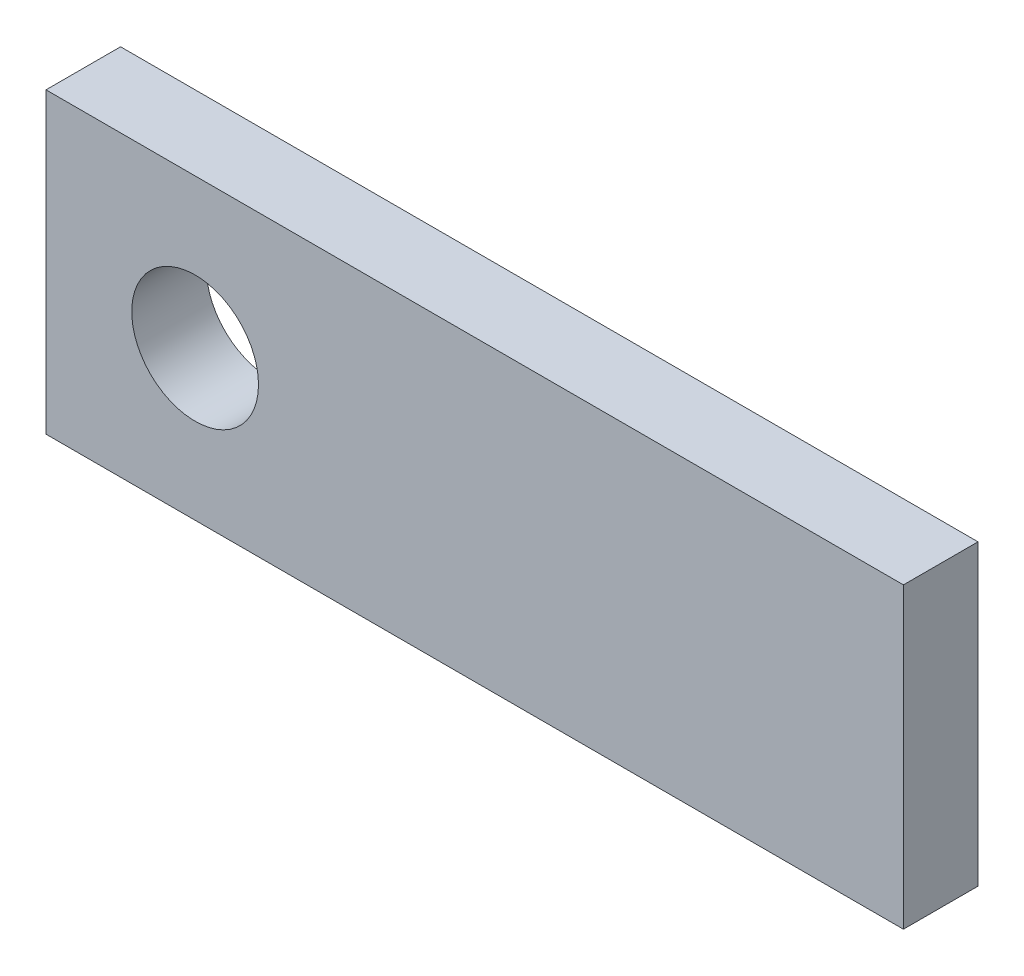
ISO-10303-21;
HEADER;
FILE_DESCRIPTION(('STEP AP214'),'2;1');
FILE_NAME('part.step','',(''),(''),'','','');
FILE_SCHEMA(('AUTOMOTIVE_DESIGN { 1 0 10303 214 1 1 1 1 }'));
ENDSEC;
DATA;
#1=APPLICATION_CONTEXT('core data for automotive mechanical design processes');
#2=APPLICATION_PROTOCOL_DEFINITION('international standard','automotive_design',2000,#1);
#3=PRODUCT_CONTEXT('',#1,'mechanical');
#4=PRODUCT('Part','Part','',(#3));
#5=PRODUCT_RELATED_PRODUCT_CATEGORY('part','',(#4));
#6=PRODUCT_DEFINITION_FORMATION('','',#4);
#7=PRODUCT_DEFINITION_CONTEXT('part definition',#1,'design');
#8=PRODUCT_DEFINITION('design','',#6,#7);
#9=PRODUCT_DEFINITION_SHAPE('','',#8);
#10=(LENGTH_UNIT() NAMED_UNIT(*) SI_UNIT(.MILLI.,.METRE.));
#11=(NAMED_UNIT(*) PLANE_ANGLE_UNIT() SI_UNIT($,.RADIAN.));
#12=(NAMED_UNIT(*) SI_UNIT($,.STERADIAN.) SOLID_ANGLE_UNIT());
#13=UNCERTAINTY_MEASURE_WITH_UNIT(LENGTH_MEASURE(1.E-05),#10,'distance_accuracy_value','');
#14=(GEOMETRIC_REPRESENTATION_CONTEXT(3) GLOBAL_UNCERTAINTY_ASSIGNED_CONTEXT((#13)) GLOBAL_UNIT_ASSIGNED_CONTEXT((#10,
#11,#12)) REPRESENTATION_CONTEXT('',''));
#15=CARTESIAN_POINT('',(0.,0.,0.));
#16=DIRECTION('',(0.,0.,1.));
#17=DIRECTION('',(1.,0.,0.));
#18=AXIS2_PLACEMENT_3D('',#15,#16,#17);
#19=CARTESIAN_POINT('',(-60.,-106.,229.4));
#20=DIRECTION('',(0.,0.,1.));
#21=DIRECTION('',(1.,0.,0.));
#22=AXIS2_PLACEMENT_3D('',#19,#20,#21);
#23=CYLINDRICAL_SURFACE('',#22,1.7);
#24=DIRECTION('',(0.,0.,1.));
#25=VECTOR('',#24,1.);
#26=CARTESIAN_POINT('',(-58.3,-106.,229.4));
#27=LINE('',#26,#25);
#28=CARTESIAN_POINT('',(-58.3,-106.,229.5));
#29=VERTEX_POINT('',#28);
#30=CARTESIAN_POINT('',(-58.3,-106.,231.5));
#31=VERTEX_POINT('',#30);
#32=EDGE_CURVE('E9',#29,#31,#27,.T.);
#33=ORIENTED_EDGE('',*,*,#32,.F.);
#34=CARTESIAN_POINT('',(-60.,-106.,229.5));
#35=DIRECTION('',(0.,0.,1.));
#36=DIRECTION('',(1.,0.,0.));
#37=AXIS2_PLACEMENT_3D('',#34,#35,#36);
#38=CIRCLE('',#37,1.7);
#39=EDGE_CURVE('E24',#29,#29,#38,.T.);
#40=ORIENTED_EDGE('',*,*,#39,.F.);
#41=ORIENTED_EDGE('',*,*,#32,.T.);
#42=CARTESIAN_POINT('',(-60.,-106.,231.5));
#43=DIRECTION('',(0.,0.,1.));
#44=DIRECTION('',(1.,0.,0.));
#45=AXIS2_PLACEMENT_3D('',#42,#43,#44);
#46=CIRCLE('',#45,1.7);
#47=EDGE_CURVE('E130',#31,#31,#46,.T.);
#48=ORIENTED_EDGE('',*,*,#47,.T.);
#49=EDGE_LOOP('',(#33,#40,#41,#48));
#50=FACE_BOUND('',#49,.T.);
#51=ADVANCED_FACE('F14',(#50),#23,.F.);
#52=CARTESIAN_POINT('',(-41.,-110.,229.5));
#53=DIRECTION('',(1.,0.,0.));
#54=DIRECTION('',(0.,1.,0.));
#55=AXIS2_PLACEMENT_3D('',#52,#53,#54);
#56=PLANE('',#55);
#57=DIRECTION('',(0.,0.,1.));
#58=VECTOR('',#57,1.);
#59=CARTESIAN_POINT('',(-41.,-110.,229.5));
#60=LINE('',#59,#58);
#61=CARTESIAN_POINT('',(-41.,-110.,229.5));
#62=VERTEX_POINT('',#61);
#63=CARTESIAN_POINT('',(-41.,-110.,231.5));
#64=VERTEX_POINT('',#63);
#65=EDGE_CURVE('E105',#62,#64,#60,.T.);
#66=ORIENTED_EDGE('',*,*,#65,.F.);
#67=DIRECTION('',(0.,1.,0.));
#68=VECTOR('',#67,1.);
#69=CARTESIAN_POINT('',(-41.,-110.,229.5));
#70=LINE('',#69,#68);
#71=CARTESIAN_POINT('',(-41.,-102.,229.5));
#72=VERTEX_POINT('',#71);
#73=EDGE_CURVE('E93',#62,#72,#70,.T.);
#74=ORIENTED_EDGE('',*,*,#73,.T.);
#75=DIRECTION('',(0.,0.,1.));
#76=VECTOR('',#75,1.);
#77=CARTESIAN_POINT('',(-41.,-102.,229.5));
#78=LINE('',#77,#76);
#79=CARTESIAN_POINT('',(-41.,-102.,231.5));
#80=VERTEX_POINT('',#79);
#81=EDGE_CURVE('E72',#72,#80,#78,.T.);
#82=ORIENTED_EDGE('',*,*,#81,.T.);
#83=DIRECTION('',(0.,1.,0.));
#84=VECTOR('',#83,1.);
#85=CARTESIAN_POINT('',(-41.,-110.,231.5));
#86=LINE('',#85,#84);
#87=EDGE_CURVE('E64',#64,#80,#86,.T.);
#88=ORIENTED_EDGE('',*,*,#87,.F.);
#89=EDGE_LOOP('',(#66,#74,#82,#88));
#90=FACE_BOUND('',#89,.T.);
#91=ADVANCED_FACE('F141',(#90),#56,.T.);
#92=CARTESIAN_POINT('',(-64.,-110.,229.5));
#93=DIRECTION('',(0.,0.,1.));
#94=DIRECTION('',(1.,0.,0.));
#95=AXIS2_PLACEMENT_3D('',#92,#93,#94);
#96=PLANE('',#95);
#97=ORIENTED_EDGE('',*,*,#39,.T.);
#98=EDGE_LOOP('',(#97));
#99=FACE_BOUND('',#98,.T.);
#100=DIRECTION('',(1.,0.,0.));
#101=VECTOR('',#100,1.);
#102=CARTESIAN_POINT('',(-64.,-102.,229.5));
#103=LINE('',#102,#101);
#104=CARTESIAN_POINT('',(-64.,-102.,229.5));
#105=VERTEX_POINT('',#104);
#106=EDGE_CURVE('E81',#105,#72,#103,.T.);
#107=ORIENTED_EDGE('',*,*,#106,.T.);
#108=ORIENTED_EDGE('',*,*,#73,.F.);
#109=DIRECTION('',(1.,0.,0.));
#110=VECTOR('',#109,1.);
#111=CARTESIAN_POINT('',(-64.,-110.,229.5));
#112=LINE('',#111,#110);
#113=CARTESIAN_POINT('',(-64.,-110.,229.5));
#114=VERTEX_POINT('',#113);
#115=EDGE_CURVE('E17',#114,#62,#112,.T.);
#116=ORIENTED_EDGE('',*,*,#115,.F.);
#117=DIRECTION('',(0.,1.,0.));
#118=VECTOR('',#117,1.);
#119=CARTESIAN_POINT('',(-64.,-110.,229.5));
#120=LINE('',#119,#118);
#121=EDGE_CURVE('E91',#114,#105,#120,.T.);
#122=ORIENTED_EDGE('',*,*,#121,.T.);
#123=EDGE_LOOP('',(#107,#108,#116,#122));
#124=FACE_BOUND('',#123,.T.);
#125=ADVANCED_FACE('F89',(#99,#124),#96,.F.);
#126=CARTESIAN_POINT('',(-64.,-102.,229.5));
#127=DIRECTION('',(0.,1.,0.));
#128=DIRECTION('',(1.,0.,0.));
#129=AXIS2_PLACEMENT_3D('',#126,#127,#128);
#130=PLANE('',#129);
#131=ORIENTED_EDGE('',*,*,#106,.F.);
#132=DIRECTION('',(0.,0.,1.));
#133=VECTOR('',#132,1.);
#134=CARTESIAN_POINT('',(-64.,-102.,229.5));
#135=LINE('',#134,#133);
#136=CARTESIAN_POINT('',(-64.,-102.,231.5));
#137=VERTEX_POINT('',#136);
#138=EDGE_CURVE('E108',#105,#137,#135,.T.);
#139=ORIENTED_EDGE('',*,*,#138,.T.);
#140=DIRECTION('',(1.,0.,0.));
#141=VECTOR('',#140,1.);
#142=CARTESIAN_POINT('',(-64.,-102.,231.5));
#143=LINE('',#142,#141);
#144=EDGE_CURVE('E128',#137,#80,#143,.T.);
#145=ORIENTED_EDGE('',*,*,#144,.T.);
#146=ORIENTED_EDGE('',*,*,#81,.F.);
#147=EDGE_LOOP('',(#131,#139,#145,#146));
#148=FACE_BOUND('',#147,.T.);
#149=ADVANCED_FACE('F132',(#148),#130,.T.);
#150=CARTESIAN_POINT('',(-64.,-110.,231.5));
#151=DIRECTION('',(0.,0.,1.));
#152=DIRECTION('',(1.,0.,0.));
#153=AXIS2_PLACEMENT_3D('',#150,#151,#152);
#154=PLANE('',#153);
#155=ORIENTED_EDGE('',*,*,#47,.F.);
#156=EDGE_LOOP('',(#155));
#157=FACE_BOUND('',#156,.T.);
#158=DIRECTION('',(0.,1.,0.));
#159=VECTOR('',#158,1.);
#160=CARTESIAN_POINT('',(-64.,-110.,231.5));
#161=LINE('',#160,#159);
#162=CARTESIAN_POINT('',(-64.,-110.,231.5));
#163=VERTEX_POINT('',#162);
#164=EDGE_CURVE('E114',#163,#137,#161,.T.);
#165=ORIENTED_EDGE('',*,*,#164,.F.);
#166=DIRECTION('',(1.,0.,0.));
#167=VECTOR('',#166,1.);
#168=CARTESIAN_POINT('',(-64.,-110.,231.5));
#169=LINE('',#168,#167);
#170=EDGE_CURVE('E97',#163,#64,#169,.T.);
#171=ORIENTED_EDGE('',*,*,#170,.T.);
#172=ORIENTED_EDGE('',*,*,#87,.T.);
#173=ORIENTED_EDGE('',*,*,#144,.F.);
#174=EDGE_LOOP('',(#165,#171,#172,#173));
#175=FACE_BOUND('',#174,.T.);
#176=ADVANCED_FACE('F127',(#157,#175),#154,.T.);
#177=CARTESIAN_POINT('',(-64.,-110.,229.5));
#178=DIRECTION('',(0.,1.,0.));
#179=DIRECTION('',(1.,0.,0.));
#180=AXIS2_PLACEMENT_3D('',#177,#178,#179);
#181=PLANE('',#180);
#182=ORIENTED_EDGE('',*,*,#65,.T.);
#183=ORIENTED_EDGE('',*,*,#170,.F.);
#184=DIRECTION('',(0.,0.,1.));
#185=VECTOR('',#184,1.);
#186=CARTESIAN_POINT('',(-64.,-110.,229.5));
#187=LINE('',#186,#185);
#188=EDGE_CURVE('E99',#114,#163,#187,.T.);
#189=ORIENTED_EDGE('',*,*,#188,.F.);
#190=ORIENTED_EDGE('',*,*,#115,.T.);
#191=EDGE_LOOP('',(#182,#183,#189,#190));
#192=FACE_BOUND('',#191,.T.);
#193=ADVANCED_FACE('F100',(#192),#181,.F.);
#194=CARTESIAN_POINT('',(-64.,-110.,229.5));
#195=DIRECTION('',(1.,0.,0.));
#196=DIRECTION('',(0.,1.,0.));
#197=AXIS2_PLACEMENT_3D('',#194,#195,#196);
#198=PLANE('',#197);
#199=ORIENTED_EDGE('',*,*,#164,.T.);
#200=ORIENTED_EDGE('',*,*,#138,.F.);
#201=ORIENTED_EDGE('',*,*,#121,.F.);
#202=ORIENTED_EDGE('',*,*,#188,.T.);
#203=EDGE_LOOP('',(#199,#200,#201,#202));
#204=FACE_BOUND('',#203,.T.);
#205=ADVANCED_FACE('F107',(#204),#198,.F.);
#206=CLOSED_SHELL('',(#51,#91,#125,#149,#176,#193,#205));
#207=MANIFOLD_SOLID_BREP('B1',#206);
#208=ADVANCED_BREP_SHAPE_REPRESENTATION('',(#18,#207),#14);
#209=SHAPE_DEFINITION_REPRESENTATION(#9,#208);
ENDSEC;
END-ISO-10303-21;
